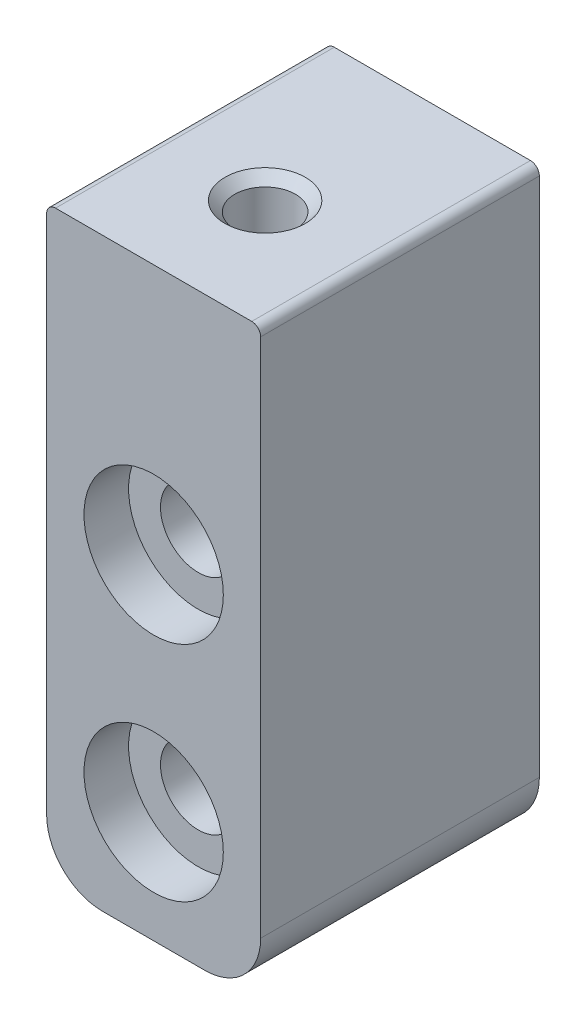
ISO-10303-21;
HEADER;
FILE_DESCRIPTION(('STEP AP214'),'2;1');
FILE_NAME('part.step','',(''),(''),'','','');
FILE_SCHEMA(('AUTOMOTIVE_DESIGN { 1 0 10303 214 1 1 1 1 }'));
ENDSEC;
DATA;
#1=APPLICATION_CONTEXT('core data for automotive mechanical design processes');
#2=APPLICATION_PROTOCOL_DEFINITION('international standard','automotive_design',2000,#1);
#3=PRODUCT_CONTEXT('',#1,'mechanical');
#4=PRODUCT('Part','Part','',(#3));
#5=PRODUCT_RELATED_PRODUCT_CATEGORY('part','',(#4));
#6=PRODUCT_DEFINITION_FORMATION('','',#4);
#7=PRODUCT_DEFINITION_CONTEXT('part definition',#1,'design');
#8=PRODUCT_DEFINITION('design','',#6,#7);
#9=PRODUCT_DEFINITION_SHAPE('','',#8);
#10=(LENGTH_UNIT() NAMED_UNIT(*) SI_UNIT(.MILLI.,.METRE.));
#11=(NAMED_UNIT(*) PLANE_ANGLE_UNIT() SI_UNIT($,.RADIAN.));
#12=(NAMED_UNIT(*) SI_UNIT($,.STERADIAN.) SOLID_ANGLE_UNIT());
#13=UNCERTAINTY_MEASURE_WITH_UNIT(LENGTH_MEASURE(1.E-05),#10,'distance_accuracy_value','');
#14=(GEOMETRIC_REPRESENTATION_CONTEXT(3) GLOBAL_UNCERTAINTY_ASSIGNED_CONTEXT((#13)) GLOBAL_UNIT_ASSIGNED_CONTEXT((#10,
#11,#12)) REPRESENTATION_CONTEXT('',''));
#15=CARTESIAN_POINT('',(0.,0.,0.));
#16=DIRECTION('',(0.,0.,1.));
#17=DIRECTION('',(1.,0.,0.));
#18=AXIS2_PLACEMENT_3D('',#15,#16,#17);
#19=CARTESIAN_POINT('',(6.096,0.,0.));
#20=DIRECTION('',(0.,0.,1.));
#21=DIRECTION('',(0.,-1.,0.));
#22=AXIS2_PLACEMENT_3D('',#19,#20,#21);
#23=PLANE('',#22);
#24=CARTESIAN_POINT('',(0.,-14.3002,0.));
#25=DIRECTION('',(0.,0.,1.));
#26=DIRECTION('',(1.,0.,0.));
#27=AXIS2_PLACEMENT_3D('',#24,#25,#26);
#28=CIRCLE('',#27,2.15265);
#29=CARTESIAN_POINT('',(2.15265,-14.3002,0.));
#30=VERTEX_POINT('',#29);
#31=EDGE_CURVE('E203',#30,#30,#28,.T.);
#32=ORIENTED_EDGE('',*,*,#31,.T.);
#33=EDGE_LOOP('',(#32));
#34=FACE_BOUND('',#33,.T.);
#35=CARTESIAN_POINT('',(0.,-27.0002,0.));
#36=DIRECTION('',(0.,0.,1.));
#37=DIRECTION('',(1.,0.,0.));
#38=AXIS2_PLACEMENT_3D('',#35,#36,#37);
#39=CIRCLE('',#38,2.15265);
#40=CARTESIAN_POINT('',(2.15265,-27.0002,0.));
#41=VERTEX_POINT('',#40);
#42=EDGE_CURVE('E179',#41,#41,#39,.T.);
#43=ORIENTED_EDGE('',*,*,#42,.T.);
#44=EDGE_LOOP('',(#43));
#45=FACE_BOUND('',#44,.T.);
#46=DIRECTION('',(0.,1.,0.));
#47=VECTOR('',#46,1.);
#48=CARTESIAN_POINT('',(-6.096,0.,0.));
#49=LINE('',#48,#47);
#50=CARTESIAN_POINT('',(-6.096,-30.1752,0.));
#51=VERTEX_POINT('',#50);
#52=CARTESIAN_POINT('',(-6.096,-0.508,0.));
#53=VERTEX_POINT('',#52);
#54=EDGE_CURVE('E162',#51,#53,#49,.T.);
#55=ORIENTED_EDGE('',*,*,#54,.T.);
#56=CARTESIAN_POINT('',(-5.588,-0.508,0.));
#57=DIRECTION('',(0.,0.,1.));
#58=DIRECTION('',(0.,-1.,0.));
#59=AXIS2_PLACEMENT_3D('',#56,#57,#58);
#60=CIRCLE('',#59,0.508);
#61=CARTESIAN_POINT('',(-5.588,0.,0.));
#62=VERTEX_POINT('',#61);
#63=EDGE_CURVE('E45',#53,#62,#60,.F.);
#64=ORIENTED_EDGE('',*,*,#63,.T.);
#65=DIRECTION('',(-1.,0.,0.));
#66=VECTOR('',#65,1.);
#67=CARTESIAN_POINT('',(6.096,0.,0.));
#68=LINE('',#67,#66);
#69=CARTESIAN_POINT('',(5.588,0.,0.));
#70=VERTEX_POINT('',#69);
#71=EDGE_CURVE('E129',#70,#62,#68,.T.);
#72=ORIENTED_EDGE('',*,*,#71,.F.);
#73=CARTESIAN_POINT('',(5.588,-0.508000000000002,0.));
#74=DIRECTION('',(0.,0.,1.));
#75=DIRECTION('',(0.,-1.,0.));
#76=AXIS2_PLACEMENT_3D('',#73,#74,#75);
#77=CIRCLE('',#76,0.508);
#78=CARTESIAN_POINT('',(6.096,-0.508000000000002,0.));
#79=VERTEX_POINT('',#78);
#80=EDGE_CURVE('E52',#70,#79,#77,.F.);
#81=ORIENTED_EDGE('',*,*,#80,.T.);
#82=DIRECTION('',(0.,1.,0.));
#83=VECTOR('',#82,1.);
#84=CARTESIAN_POINT('',(6.096,0.,0.));
#85=LINE('',#84,#83);
#86=CARTESIAN_POINT('',(6.096,-30.1752,0.));
#87=VERTEX_POINT('',#86);
#88=EDGE_CURVE('E107',#87,#79,#85,.T.);
#89=ORIENTED_EDGE('',*,*,#88,.F.);
#90=CARTESIAN_POINT('',(2.921,-30.1752,0.));
#91=DIRECTION('',(0.,0.,1.));
#92=DIRECTION('',(0.,-1.,0.));
#93=AXIS2_PLACEMENT_3D('',#90,#91,#92);
#94=CIRCLE('',#93,3.175);
#95=CARTESIAN_POINT('',(2.921,-33.3502,0.));
#96=VERTEX_POINT('',#95);
#97=EDGE_CURVE('E104',#87,#96,#94,.F.);
#98=ORIENTED_EDGE('',*,*,#97,.T.);
#99=DIRECTION('',(-1.,0.,0.));
#100=VECTOR('',#99,1.);
#101=CARTESIAN_POINT('',(6.096,-33.3502,0.));
#102=LINE('',#101,#100);
#103=CARTESIAN_POINT('',(-2.921,-33.3502,0.));
#104=VERTEX_POINT('',#103);
#105=EDGE_CURVE('E106',#96,#104,#102,.T.);
#106=ORIENTED_EDGE('',*,*,#105,.T.);
#107=CARTESIAN_POINT('',(-2.921,-30.1752,0.));
#108=DIRECTION('',(0.,0.,1.));
#109=DIRECTION('',(0.,-1.,0.));
#110=AXIS2_PLACEMENT_3D('',#107,#108,#109);
#111=CIRCLE('',#110,3.175);
#112=EDGE_CURVE('E112',#104,#51,#111,.F.);
#113=ORIENTED_EDGE('',*,*,#112,.T.);
#114=EDGE_LOOP('',(#55,#64,#72,#81,#89,#98,#106,#113));
#115=FACE_BOUND('',#114,.T.);
#116=ADVANCED_FACE('F37',(#34,#45,#115),#23,.F.);
#117=CARTESIAN_POINT('',(6.096,0.,0.));
#118=DIRECTION('',(0.,-1.,0.));
#119=DIRECTION('',(0.,0.,-1.));
#120=AXIS2_PLACEMENT_3D('',#117,#118,#119);
#121=PLANE('',#120);
#122=CARTESIAN_POINT('',(0.,0.,9.525));
#123=DIRECTION('',(0.,1.,0.));
#124=DIRECTION('',(0.,0.,1.));
#125=AXIS2_PLACEMENT_3D('',#122,#123,#124);
#126=CIRCLE('',#125,2.286);
#127=CARTESIAN_POINT('',(0.,0.,11.811));
#128=VERTEX_POINT('',#127);
#129=EDGE_CURVE('E219',#128,#128,#126,.T.);
#130=ORIENTED_EDGE('',*,*,#129,.F.);
#131=EDGE_LOOP('',(#130));
#132=FACE_BOUND('',#131,.T.);
#133=ORIENTED_EDGE('',*,*,#71,.T.);
#134=DIRECTION('',(0.,0.,1.));
#135=VECTOR('',#134,1.);
#136=CARTESIAN_POINT('',(-5.588,0.,15.875));
#137=LINE('',#136,#135);
#138=CARTESIAN_POINT('',(-5.588,0.,15.875));
#139=VERTEX_POINT('',#138);
#140=EDGE_CURVE('E153',#62,#139,#137,.T.);
#141=ORIENTED_EDGE('',*,*,#140,.T.);
#142=DIRECTION('',(-1.,0.,0.));
#143=VECTOR('',#142,1.);
#144=CARTESIAN_POINT('',(6.096,0.,15.875));
#145=LINE('',#144,#143);
#146=CARTESIAN_POINT('',(5.588,0.,15.875));
#147=VERTEX_POINT('',#146);
#148=EDGE_CURVE('E133',#147,#139,#145,.T.);
#149=ORIENTED_EDGE('',*,*,#148,.F.);
#150=DIRECTION('',(0.,0.,1.));
#151=VECTOR('',#150,1.);
#152=CARTESIAN_POINT('',(5.588,0.,0.));
#153=LINE('',#152,#151);
#154=EDGE_CURVE('E151',#147,#70,#153,.F.);
#155=ORIENTED_EDGE('',*,*,#154,.T.);
#156=EDGE_LOOP('',(#133,#141,#149,#155));
#157=FACE_BOUND('',#156,.T.);
#158=ADVANCED_FACE('F166',(#132,#157),#121,.F.);
#159=CARTESIAN_POINT('',(6.096,0.,15.875));
#160=DIRECTION('',(0.,0.,-1.));
#161=DIRECTION('',(0.,1.,0.));
#162=AXIS2_PLACEMENT_3D('',#159,#160,#161);
#163=PLANE('',#162);
#164=CARTESIAN_POINT('',(0.,-14.3002,15.875));
#165=DIRECTION('',(0.,0.,1.));
#166=DIRECTION('',(1.,0.,0.));
#167=AXIS2_PLACEMENT_3D('',#164,#165,#166);
#168=CIRCLE('',#167,3.96875);
#169=CARTESIAN_POINT('',(3.96875,-14.3002,15.875));
#170=VERTEX_POINT('',#169);
#171=EDGE_CURVE('E212',#170,#170,#168,.T.);
#172=ORIENTED_EDGE('',*,*,#171,.F.);
#173=EDGE_LOOP('',(#172));
#174=FACE_BOUND('',#173,.T.);
#175=CARTESIAN_POINT('',(0.,-27.0002,15.875));
#176=DIRECTION('',(0.,0.,1.));
#177=DIRECTION('',(1.,0.,0.));
#178=AXIS2_PLACEMENT_3D('',#175,#176,#177);
#179=CIRCLE('',#178,3.96875);
#180=CARTESIAN_POINT('',(3.96875,-27.0002,15.875));
#181=VERTEX_POINT('',#180);
#182=EDGE_CURVE('E199',#181,#181,#179,.T.);
#183=ORIENTED_EDGE('',*,*,#182,.F.);
#184=EDGE_LOOP('',(#183));
#185=FACE_BOUND('',#184,.T.);
#186=ORIENTED_EDGE('',*,*,#148,.T.);
#187=CARTESIAN_POINT('',(-5.588,-0.508000000000002,15.875));
#188=DIRECTION('',(0.,0.,-1.));
#189=DIRECTION('',(0.,1.,0.));
#190=AXIS2_PLACEMENT_3D('',#187,#188,#189);
#191=CIRCLE('',#190,0.508);
#192=CARTESIAN_POINT('',(-6.096,-0.508000000000002,15.875));
#193=VERTEX_POINT('',#192);
#194=EDGE_CURVE('E158',#139,#193,#191,.F.);
#195=ORIENTED_EDGE('',*,*,#194,.T.);
#196=DIRECTION('',(0.,-1.,0.));
#197=VECTOR('',#196,1.);
#198=CARTESIAN_POINT('',(-6.096,0.,15.875));
#199=LINE('',#198,#197);
#200=CARTESIAN_POINT('',(-6.096,-30.1752,15.875));
#201=VERTEX_POINT('',#200);
#202=EDGE_CURVE('E173',#193,#201,#199,.T.);
#203=ORIENTED_EDGE('',*,*,#202,.T.);
#204=CARTESIAN_POINT('',(-2.921,-30.1752,15.875));
#205=DIRECTION('',(0.,0.,-1.));
#206=DIRECTION('',(0.,1.,0.));
#207=AXIS2_PLACEMENT_3D('',#204,#205,#206);
#208=CIRCLE('',#207,3.175);
#209=CARTESIAN_POINT('',(-2.921,-33.3502,15.875));
#210=VERTEX_POINT('',#209);
#211=EDGE_CURVE('E147',#201,#210,#208,.F.);
#212=ORIENTED_EDGE('',*,*,#211,.T.);
#213=DIRECTION('',(-1.,0.,0.));
#214=VECTOR('',#213,1.);
#215=CARTESIAN_POINT('',(6.096,-33.3502,15.875));
#216=LINE('',#215,#214);
#217=CARTESIAN_POINT('',(2.921,-33.3502,15.875));
#218=VERTEX_POINT('',#217);
#219=EDGE_CURVE('E122',#218,#210,#216,.T.);
#220=ORIENTED_EDGE('',*,*,#219,.F.);
#221=CARTESIAN_POINT('',(2.921,-30.1752,15.875));
#222=DIRECTION('',(0.,0.,-1.));
#223=DIRECTION('',(0.,1.,0.));
#224=AXIS2_PLACEMENT_3D('',#221,#222,#223);
#225=CIRCLE('',#224,3.175);
#226=CARTESIAN_POINT('',(6.096,-30.1752,15.875));
#227=VERTEX_POINT('',#226);
#228=EDGE_CURVE('E128',#218,#227,#225,.F.);
#229=ORIENTED_EDGE('',*,*,#228,.T.);
#230=DIRECTION('',(0.,-1.,0.));
#231=VECTOR('',#230,1.);
#232=CARTESIAN_POINT('',(6.096,0.,15.875));
#233=LINE('',#232,#231);
#234=CARTESIAN_POINT('',(6.096,-0.508000000000003,15.875));
#235=VERTEX_POINT('',#234);
#236=EDGE_CURVE('E123',#235,#227,#233,.T.);
#237=ORIENTED_EDGE('',*,*,#236,.F.);
#238=CARTESIAN_POINT('',(5.588,-0.508000000000003,15.875));
#239=DIRECTION('',(0.,0.,-1.));
#240=DIRECTION('',(0.,1.,0.));
#241=AXIS2_PLACEMENT_3D('',#238,#239,#240);
#242=CIRCLE('',#241,0.508);
#243=EDGE_CURVE('E156',#235,#147,#242,.F.);
#244=ORIENTED_EDGE('',*,*,#243,.T.);
#245=EDGE_LOOP('',(#186,#195,#203,#212,#220,#229,#237,#244));
#246=FACE_BOUND('',#245,.T.);
#247=ADVANCED_FACE('F172',(#174,#185,#246),#163,.F.);
#248=CARTESIAN_POINT('',(6.096,-33.3502,0.));
#249=DIRECTION('',(0.,1.,0.));
#250=DIRECTION('',(0.,0.,1.));
#251=AXIS2_PLACEMENT_3D('',#248,#249,#250);
#252=PLANE('',#251);
#253=ORIENTED_EDGE('',*,*,#219,.T.);
#254=DIRECTION('',(0.,0.,-1.));
#255=VECTOR('',#254,1.);
#256=CARTESIAN_POINT('',(-2.921,-33.3502,0.));
#257=LINE('',#256,#255);
#258=EDGE_CURVE('E113',#210,#104,#257,.T.);
#259=ORIENTED_EDGE('',*,*,#258,.T.);
#260=ORIENTED_EDGE('',*,*,#105,.F.);
#261=DIRECTION('',(0.,0.,-1.));
#262=VECTOR('',#261,1.);
#263=CARTESIAN_POINT('',(2.921,-33.3502,0.));
#264=LINE('',#263,#262);
#265=EDGE_CURVE('E119',#96,#218,#264,.F.);
#266=ORIENTED_EDGE('',*,*,#265,.T.);
#267=EDGE_LOOP('',(#253,#259,#260,#266));
#268=FACE_BOUND('',#267,.T.);
#269=ADVANCED_FACE('F118',(#268),#252,.F.);
#270=CARTESIAN_POINT('',(6.096,-33.3502,0.));
#271=DIRECTION('',(-1.,0.,0.));
#272=DIRECTION('',(0.,0.,1.));
#273=AXIS2_PLACEMENT_3D('',#270,#271,#272);
#274=PLANE('',#273);
#275=ORIENTED_EDGE('',*,*,#88,.T.);
#276=DIRECTION('',(0.,0.,1.));
#277=VECTOR('',#276,1.);
#278=CARTESIAN_POINT('',(6.096,-0.508000000000002,0.));
#279=LINE('',#278,#277);
#280=EDGE_CURVE('E12',#79,#235,#279,.T.);
#281=ORIENTED_EDGE('',*,*,#280,.T.);
#282=ORIENTED_EDGE('',*,*,#236,.T.);
#283=DIRECTION('',(0.,0.,-1.));
#284=VECTOR('',#283,1.);
#285=CARTESIAN_POINT('',(6.096,-30.1752,0.));
#286=LINE('',#285,#284);
#287=EDGE_CURVE('E149',#227,#87,#286,.T.);
#288=ORIENTED_EDGE('',*,*,#287,.T.);
#289=EDGE_LOOP('',(#275,#281,#282,#288));
#290=FACE_BOUND('',#289,.T.);
#291=ADVANCED_FACE('F252',(#290),#274,.F.);
#292=CARTESIAN_POINT('',(-6.096,-33.3502,0.));
#293=DIRECTION('',(-1.,0.,0.));
#294=DIRECTION('',(0.,0.,1.));
#295=AXIS2_PLACEMENT_3D('',#292,#293,#294);
#296=PLANE('',#295);
#297=ORIENTED_EDGE('',*,*,#202,.F.);
#298=DIRECTION('',(0.,0.,1.));
#299=VECTOR('',#298,1.);
#300=CARTESIAN_POINT('',(-6.096,-0.508,0.));
#301=LINE('',#300,#299);
#302=EDGE_CURVE('E60',#193,#53,#301,.F.);
#303=ORIENTED_EDGE('',*,*,#302,.T.);
#304=ORIENTED_EDGE('',*,*,#54,.F.);
#305=DIRECTION('',(0.,0.,-1.));
#306=VECTOR('',#305,1.);
#307=CARTESIAN_POINT('',(-6.096,-30.1752,15.875));
#308=LINE('',#307,#306);
#309=EDGE_CURVE('E143',#51,#201,#308,.F.);
#310=ORIENTED_EDGE('',*,*,#309,.T.);
#311=EDGE_LOOP('',(#297,#303,#304,#310));
#312=FACE_BOUND('',#311,.T.);
#313=ADVANCED_FACE('F174',(#312),#296,.T.);
#314=CARTESIAN_POINT('',(0.,-27.0002,15.875));
#315=DIRECTION('',(0.,0.,1.));
#316=DIRECTION('',(1.,0.,0.));
#317=AXIS2_PLACEMENT_3D('',#314,#315,#316);
#318=CYLINDRICAL_SURFACE('',#317,2.15265);
#319=ORIENTED_EDGE('',*,*,#42,.F.);
#320=EDGE_LOOP('',(#319));
#321=FACE_BOUND('',#320,.T.);
#322=CARTESIAN_POINT('',(0.,-27.0002,13.335));
#323=DIRECTION('',(0.,0.,1.));
#324=DIRECTION('',(1.,0.,0.));
#325=AXIS2_PLACEMENT_3D('',#322,#323,#324);
#326=CIRCLE('',#325,2.15265);
#327=CARTESIAN_POINT('',(2.15265,-27.0002,13.335));
#328=VERTEX_POINT('',#327);
#329=EDGE_CURVE('E193',#328,#328,#326,.T.);
#330=ORIENTED_EDGE('',*,*,#329,.T.);
#331=EDGE_LOOP('',(#330));
#332=FACE_BOUND('',#331,.T.);
#333=ADVANCED_FACE('F260',(#321,#332),#318,.F.);
#334=CARTESIAN_POINT('',(2.15265,-27.0002,13.335));
#335=DIRECTION('',(0.,0.,-1.));
#336=DIRECTION('',(-1.,0.,0.));
#337=AXIS2_PLACEMENT_3D('',#334,#335,#336);
#338=PLANE('',#337);
#339=ORIENTED_EDGE('',*,*,#329,.F.);
#340=EDGE_LOOP('',(#339));
#341=FACE_BOUND('',#340,.T.);
#342=CARTESIAN_POINT('',(0.,-27.0002,13.335));
#343=DIRECTION('',(0.,0.,1.));
#344=DIRECTION('',(1.,0.,0.));
#345=AXIS2_PLACEMENT_3D('',#342,#343,#344);
#346=CIRCLE('',#345,3.96875);
#347=CARTESIAN_POINT('',(3.96875,-27.0002,13.335));
#348=VERTEX_POINT('',#347);
#349=EDGE_CURVE('E196',#348,#348,#346,.T.);
#350=ORIENTED_EDGE('',*,*,#349,.T.);
#351=EDGE_LOOP('',(#350));
#352=FACE_BOUND('',#351,.T.);
#353=ADVANCED_FACE('F265',(#341,#352),#338,.F.);
#354=CARTESIAN_POINT('',(0.,-27.0002,15.875));
#355=DIRECTION('',(0.,0.,1.));
#356=DIRECTION('',(1.,0.,0.));
#357=AXIS2_PLACEMENT_3D('',#354,#355,#356);
#358=CYLINDRICAL_SURFACE('',#357,3.96875);
#359=ORIENTED_EDGE('',*,*,#349,.F.);
#360=EDGE_LOOP('',(#359));
#361=FACE_BOUND('',#360,.T.);
#362=ORIENTED_EDGE('',*,*,#182,.T.);
#363=EDGE_LOOP('',(#362));
#364=FACE_BOUND('',#363,.T.);
#365=ADVANCED_FACE('F269',(#361,#364),#358,.F.);
#366=CARTESIAN_POINT('',(0.,-14.3002,15.875));
#367=DIRECTION('',(0.,0.,1.));
#368=DIRECTION('',(1.,0.,0.));
#369=AXIS2_PLACEMENT_3D('',#366,#367,#368);
#370=CYLINDRICAL_SURFACE('',#369,2.15265);
#371=CARTESIAN_POINT('',(0.,-12.14755,11.2522));
#372=CARTESIAN_POINT('',(0.0828486453500373,-12.1475566224178,11.2521931822336));
#373=CARTESIAN_POINT('',(0.165806587410505,-12.1523815529834,11.2461898141937));
#374=CARTESIAN_POINT('',(0.329047512493893,-12.1712524214495,11.222581733653));
#375=CARTESIAN_POINT('',(0.409324723077608,-12.1853170593674,11.2049534935827));
#376=CARTESIAN_POINT('',(0.564399475847473,-12.221341233981,11.1593700840898));
#377=CARTESIAN_POINT('',(0.639228145264779,-12.2432508508739,11.1314801822372));
#378=CARTESIAN_POINT('',(0.782547643910851,-12.2933871362543,11.0667626556805));
#379=CARTESIAN_POINT('',(0.851038148592336,-12.3216141279717,11.029934573644));
#380=CARTESIAN_POINT('',(1.0037492563681,-12.3934291287842,10.9344030274948));
#381=CARTESIAN_POINT('',(1.08509839486217,-12.4389374711482,10.8725530381713));
#382=CARTESIAN_POINT('',(1.23455416609968,-12.5345050970952,10.7371523278942));
#383=CARTESIAN_POINT('',(1.30262152825393,-12.5845772529293,10.6635680435101));
#384=CARTESIAN_POINT('',(1.42608717407828,-12.6856939194386,10.5046933655226));
#385=CARTESIAN_POINT('',(1.4812665468842,-12.7367412207488,10.4192352807132));
#386=CARTESIAN_POINT('',(1.57672169999146,-12.833095089715,10.2374966429837));
#387=CARTESIAN_POINT('',(1.61704700555517,-12.8784203967274,10.1412534749238));
#388=CARTESIAN_POINT('',(1.66698557635806,-12.9378913450551,9.98117505530567));
#389=CARTESIAN_POINT('',(1.68236083633576,-12.9570874472733,9.92104384386153));
#390=CARTESIAN_POINT('',(1.70668652795431,-12.9881353379129,9.79771425106427));
#391=CARTESIAN_POINT('',(1.71565281831129,-13.0000052446699,9.73452385657039));
#392=CARTESIAN_POINT('',(1.72652179631027,-13.0144631562615,9.60584381213406));
#393=CARTESIAN_POINT('',(1.72836064653766,-13.0169672687594,9.54033866175485));
#394=CARTESIAN_POINT('',(1.72459894303726,-13.0119199167789,9.40991442620071));
#395=CARTESIAN_POINT('',(1.7189923792542,-13.004360328711,9.34499585712941));
#396=CARTESIAN_POINT('',(1.69949954324349,-12.9788803622684,9.20812285337038));
#397=CARTESIAN_POINT('',(1.68448156656511,-12.9595564618783,9.13660411750049));
#398=CARTESIAN_POINT('',(1.64650496122898,-12.9131821193538,8.99829574337548));
#399=CARTESIAN_POINT('',(1.62352263221427,-12.886108658361,8.93152094499352));
#400=CARTESIAN_POINT('',(1.55736543637995,-12.8129248101059,8.77087225478823));
#401=CARTESIAN_POINT('',(1.50983481860842,-12.7640496032915,8.68006960894411));
#402=CARTESIAN_POINT('',(1.40051168527332,-12.6637345290673,8.50908042669843));
#403=CARTESIAN_POINT('',(1.33869802443952,-12.6122909487241,8.42890991032669));
#404=CARTESIAN_POINT('',(1.19920411098472,-12.5103702643382,8.27760129609948));
#405=CARTESIAN_POINT('',(1.12112790592116,-12.459960599863,8.20677912293775));
#406=CARTESIAN_POINT('',(0.950658432843426,-12.366408441162,8.07906078256295));
#407=CARTESIAN_POINT('',(0.858304291215654,-12.3232467399853,8.02212762227684));
#408=CARTESIAN_POINT('',(0.68900156757178,-12.2593982786616,7.93923012414489));
#409=CARTESIAN_POINT('',(0.615199628423848,-12.2358140472959,7.90906554110431));
#410=CARTESIAN_POINT('',(0.462266519693319,-12.196291959123,7.85887015678328));
#411=CARTESIAN_POINT('',(0.383139400285601,-12.1803483643785,7.8388317503655));
#412=CARTESIAN_POINT('',(0.22111707687046,-12.1573667620696,7.81002820438601));
#413=CARTESIAN_POINT('',(0.138204059930139,-12.1503766027325,7.80132363011817));
#414=CARTESIAN_POINT('',(-0.0282567621822698,-12.146127524386,7.7960265245845));
#415=CARTESIAN_POINT('',(-0.111804429753873,-12.1488665528492,7.79943143862921));
#416=CARTESIAN_POINT('',(-0.269764084253015,-12.1631702638143,7.81730034447163));
#417=CARTESIAN_POINT('',(-0.34435676166594,-12.1739796333488,7.83081807315197));
#418=CARTESIAN_POINT('',(-0.489837476964898,-12.2027101416528,7.86701854560647));
#419=CARTESIAN_POINT('',(-0.560724437967631,-12.2206333348444,7.88970393697133));
#420=CARTESIAN_POINT('',(-0.701508113820445,-12.2636525546039,7.94476069847374));
#421=CARTESIAN_POINT('',(-0.77109896052386,-12.2891097583622,7.97762508716945));
#422=CARTESIAN_POINT('',(-0.903735561787044,-12.3451160883866,8.05114855838283));
#423=CARTESIAN_POINT('',(-0.966780897432259,-12.3756655402325,8.09180813932154));
#424=CARTESIAN_POINT('',(-1.09716919438881,-12.4463908368645,8.18814034410565));
#425=CARTESIAN_POINT('',(-1.16308759689513,-12.4872962963098,8.24519828585097));
#426=CARTESIAN_POINT('',(-1.28509276444527,-12.5716321147039,8.36773536379708));
#427=CARTESIAN_POINT('',(-1.34115160457031,-12.6150691955521,8.43323753631595));
#428=CARTESIAN_POINT('',(-1.42307820149389,-12.6845249446912,8.544793659333));
#429=CARTESIAN_POINT('',(-1.45217211954832,-12.7107035475972,8.58841870982389));
#430=CARTESIAN_POINT('',(-1.50651370192734,-12.7621117132247,8.67859010336987));
#431=CARTESIAN_POINT('',(-1.53175936071258,-12.7873407759658,8.72513795193549));
#432=CARTESIAN_POINT('',(-1.57812092578641,-12.8357697338658,8.82102562062576));
#433=CARTESIAN_POINT('',(-1.59925099344121,-12.8589764297838,8.87035508563038));
#434=CARTESIAN_POINT('',(-1.63717047660621,-12.9022011129867,8.9719796333207));
#435=CARTESIAN_POINT('',(-1.65396287975668,-12.9222212913723,9.02427264437957));
#436=CARTESIAN_POINT('',(-1.6838879866085,-12.958920853926,9.13598066650064));
#437=CARTESIAN_POINT('',(-1.69663113748464,-12.9752158650495,9.19563271966042));
#438=CARTESIAN_POINT('',(-1.71578374416374,-13.0001064751687,9.31742769927743));
#439=CARTESIAN_POINT('',(-1.72220960448203,-13.0087220104887,9.37956373591291));
#440=CARTESIAN_POINT('',(-1.72823535208509,-13.0167920182979,9.50518187401097));
#441=CARTESIAN_POINT('',(-1.72779334126101,-13.0161902601172,9.5686698761381));
#442=CARTESIAN_POINT('',(-1.72002333174313,-13.0058055320027,9.69449575968973));
#443=CARTESIAN_POINT('',(-1.71268513165036,-12.996008960387,9.75683179771303));
#444=CARTESIAN_POINT('',(-1.68909245572359,-12.9655407226171,9.89402898548541));
#445=CARTESIAN_POINT('',(-1.67105933521942,-12.9427532167803,9.96809601206792));
#446=CARTESIAN_POINT('',(-1.62653876958782,-12.8897134716748,10.1108482369334));
#447=CARTESIAN_POINT('',(-1.60002624468727,-12.8594391494489,10.1795167075093));
#448=CARTESIAN_POINT('',(-1.52523337744794,-12.7797486234503,10.3424918934215));
#449=CARTESIAN_POINT('',(-1.47258053483596,-12.7280285085964,10.4336581200117));
#450=CARTESIAN_POINT('',(-1.35221034906983,-12.6233463054487,10.6046667542878));
#451=CARTESIAN_POINT('',(-1.28447451789063,-12.5703827649131,10.6844950660988));
#452=CARTESIAN_POINT('',(-1.132960083917,-12.4674871553343,10.8330729717498));
#453=CARTESIAN_POINT('',(-1.04894006467103,-12.4176178561466,10.9016228304521));
#454=CARTESIAN_POINT('',(-0.866199096451856,-12.3268969692282,11.0232896581117));
#455=CARTESIAN_POINT('',(-0.767522045290688,-12.2860193287015,11.0764513586232));
#456=CARTESIAN_POINT('',(-0.591680171934353,-12.2291117120432,11.149517786341));
#457=CARTESIAN_POINT('',(-0.517868983385237,-12.2093209307892,11.1746180222016));
#458=CARTESIAN_POINT('',(-0.366042910464745,-12.1774929419907,11.2147800223729));
#459=CARTESIAN_POINT('',(-0.288039010161874,-12.1654364515919,11.2298667552697));
#460=CARTESIAN_POINT('',(-0.174465202932963,-12.1543482616844,11.2437210721158));
#461=CARTESIAN_POINT('',(-0.139706932107876,-12.1518048642634,11.2468946431347));
#462=CARTESIAN_POINT('',(-0.0699723090375966,-12.148404127623,11.251135805717));
#463=CARTESIAN_POINT('',(-0.0349959053297823,-12.1475472026398,11.252202879877));
#464=CARTESIAN_POINT('',(0.,-12.14755,11.2522));
#465=B_SPLINE_CURVE_WITH_KNOTS('',3,(#371,#372,#373,#374,#375,#376,#377,#378,#379,#380,#381,
#382,#383,#384,#385,#386,#387,#388,#389,#390,#391,#392,#393,#394,#395,#396,#397,#398,#399,#400,
#401,#402,#403,#404,#405,#406,#407,#408,#409,#410,#411,#412,#413,#414,#415,#416,#417,#418,#419,
#420,#421,#422,#423,#424,#425,#426,#427,#428,#429,#430,#431,#432,#433,#434,#435,#436,#437,#438,
#439,#440,#441,#442,#443,#444,#445,#446,#447,#448,#449,#450,#451,#452,#453,#454,#455,#456,#457,
#458,#459,#460,#461,#462,#463,#464),.UNSPECIFIED.,.T.,.F.,(4,2,2,2,2,2,2,2,2,2,2,2,2,2,2,2,2,2,
2,2,2,2,2,2,2,2,2,2,2,2,2,2,2,2,2,2,2,2,2,2,2,2,2,2,2,2,4),(0.,0.248393617025248,
0.497291506987842,0.744632943665383,0.99198703852202,1.32581448323113,1.66061448596262,
2.00074377599614,2.33972854309195,2.5340056362374,2.72780031915442,2.92332678042962,
3.11901116971711,3.34452064710877,3.57070704253007,3.90956970884322,4.24893729409409,
4.59781126962069,4.94574562555535,5.19418532180443,5.44243815220581,5.69201221456174,
5.94153362841738,6.17023952798782,6.39901152432122,6.64129783783645,6.88359964819766,
7.171507073979,7.46021724024278,7.63586824333076,7.81161047711742,7.98673687988162,
8.16174233777544,8.35045200246358,8.5386703279371,8.72803734586881,8.91768493243927,
9.15504191778598,9.39310753582352,9.74319601307862,10.093715998075,10.4498966966194,
10.8050313762007,11.0453969877535,11.2851609752128,11.3900585884442,11.4949819637053),.UNSPECIFIED.);
#466=CARTESIAN_POINT('',(0.,-12.14755,11.2522));
#467=VERTEX_POINT('',#466);
#468=EDGE_CURVE('E136',#467,#467,#465,.T.);
#469=ORIENTED_EDGE('',*,*,#468,.T.);
#470=EDGE_LOOP('',(#469));
#471=FACE_BOUND('',#470,.T.);
#472=ORIENTED_EDGE('',*,*,#31,.F.);
#473=EDGE_LOOP('',(#472));
#474=FACE_BOUND('',#473,.T.);
#475=CARTESIAN_POINT('',(0.,-14.3002,13.335));
#476=DIRECTION('',(0.,0.,1.));
#477=DIRECTION('',(1.,0.,0.));
#478=AXIS2_PLACEMENT_3D('',#475,#476,#477);
#479=CIRCLE('',#478,2.15265);
#480=CARTESIAN_POINT('',(2.15265,-14.3002,13.335));
#481=VERTEX_POINT('',#480);
#482=EDGE_CURVE('E207',#481,#481,#479,.T.);
#483=ORIENTED_EDGE('',*,*,#482,.T.);
#484=EDGE_LOOP('',(#483));
#485=FACE_BOUND('',#484,.T.);
#486=ADVANCED_FACE('F272',(#471,#474,#485),#370,.F.);
#487=CARTESIAN_POINT('',(2.15265,-14.3002,13.335));
#488=DIRECTION('',(0.,0.,-1.));
#489=DIRECTION('',(-1.,0.,0.));
#490=AXIS2_PLACEMENT_3D('',#487,#488,#489);
#491=PLANE('',#490);
#492=ORIENTED_EDGE('',*,*,#482,.F.);
#493=EDGE_LOOP('',(#492));
#494=FACE_BOUND('',#493,.T.);
#495=CARTESIAN_POINT('',(0.,-14.3002,13.335));
#496=DIRECTION('',(0.,0.,1.));
#497=DIRECTION('',(1.,0.,0.));
#498=AXIS2_PLACEMENT_3D('',#495,#496,#497);
#499=CIRCLE('',#498,3.96875);
#500=CARTESIAN_POINT('',(3.96875,-14.3002,13.335));
#501=VERTEX_POINT('',#500);
#502=EDGE_CURVE('E210',#501,#501,#499,.T.);
#503=ORIENTED_EDGE('',*,*,#502,.T.);
#504=EDGE_LOOP('',(#503));
#505=FACE_BOUND('',#504,.T.);
#506=ADVANCED_FACE('F277',(#494,#505),#491,.F.);
#507=CARTESIAN_POINT('',(0.,-14.3002,15.875));
#508=DIRECTION('',(0.,0.,1.));
#509=DIRECTION('',(1.,0.,0.));
#510=AXIS2_PLACEMENT_3D('',#507,#508,#509);
#511=CYLINDRICAL_SURFACE('',#510,3.96875);
#512=ORIENTED_EDGE('',*,*,#502,.F.);
#513=EDGE_LOOP('',(#512));
#514=FACE_BOUND('',#513,.T.);
#515=ORIENTED_EDGE('',*,*,#171,.T.);
#516=EDGE_LOOP('',(#515));
#517=FACE_BOUND('',#516,.T.);
#518=ADVANCED_FACE('F281',(#514,#517),#511,.F.);
#519=CARTESIAN_POINT('',(0.,0.,9.525));
#520=DIRECTION('',(0.,1.,0.));
#521=DIRECTION('',(0.,0.,1.));
#522=AXIS2_PLACEMENT_3D('',#519,#520,#521);
#523=CYLINDRICAL_SURFACE('',#522,1.7272);
#524=CARTESIAN_POINT('',(0.,-0.558800000000001,9.525));
#525=DIRECTION('',(0.,1.,0.));
#526=DIRECTION('',(0.,0.,1.));
#527=AXIS2_PLACEMENT_3D('',#524,#525,#526);
#528=CIRCLE('',#527,1.7272);
#529=CARTESIAN_POINT('',(0.,-0.558800000000001,11.2522));
#530=VERTEX_POINT('',#529);
#531=EDGE_CURVE('E216',#530,#530,#528,.T.);
#532=ORIENTED_EDGE('',*,*,#531,.T.);
#533=EDGE_LOOP('',(#532));
#534=FACE_BOUND('',#533,.T.);
#535=ORIENTED_EDGE('',*,*,#468,.F.);
#536=EDGE_LOOP('',(#535));
#537=FACE_BOUND('',#536,.T.);
#538=ADVANCED_FACE('F284',(#534,#537),#523,.F.);
#539=CARTESIAN_POINT('',(0.,0.,9.525));
#540=DIRECTION('',(0.,1.,0.));
#541=DIRECTION('',(0.,0.,1.));
#542=AXIS2_PLACEMENT_3D('',#539,#540,#541);
#543=CONICAL_SURFACE('',#542,2.286,0.785398163397449);
#544=ORIENTED_EDGE('',*,*,#531,.F.);
#545=EDGE_LOOP('',(#544));
#546=FACE_BOUND('',#545,.T.);
#547=ORIENTED_EDGE('',*,*,#129,.T.);
#548=EDGE_LOOP('',(#547));
#549=FACE_BOUND('',#548,.T.);
#550=ADVANCED_FACE('F223',(#546,#549),#543,.F.);
#551=CARTESIAN_POINT('',(-2.921,-30.1752,0.));
#552=DIRECTION('',(0.,0.,1.));
#553=DIRECTION('',(1.,0.,0.));
#554=AXIS2_PLACEMENT_3D('',#551,#552,#553);
#555=CYLINDRICAL_SURFACE('',#554,3.175);
#556=ORIENTED_EDGE('',*,*,#211,.F.);
#557=ORIENTED_EDGE('',*,*,#309,.F.);
#558=ORIENTED_EDGE('',*,*,#112,.F.);
#559=ORIENTED_EDGE('',*,*,#258,.F.);
#560=EDGE_LOOP('',(#556,#557,#558,#559));
#561=FACE_BOUND('',#560,.T.);
#562=ADVANCED_FACE('F237',(#561),#555,.T.);
#563=CARTESIAN_POINT('',(2.921,-30.1752,0.));
#564=DIRECTION('',(0.,0.,-1.));
#565=DIRECTION('',(-1.,0.,0.));
#566=AXIS2_PLACEMENT_3D('',#563,#564,#565);
#567=CYLINDRICAL_SURFACE('',#566,3.175);
#568=ORIENTED_EDGE('',*,*,#228,.F.);
#569=ORIENTED_EDGE('',*,*,#265,.F.);
#570=ORIENTED_EDGE('',*,*,#97,.F.);
#571=ORIENTED_EDGE('',*,*,#287,.F.);
#572=EDGE_LOOP('',(#568,#569,#570,#571));
#573=FACE_BOUND('',#572,.T.);
#574=ADVANCED_FACE('F126',(#573),#567,.T.);
#575=CARTESIAN_POINT('',(-5.588,-0.508,0.));
#576=DIRECTION('',(0.,0.,-1.));
#577=DIRECTION('',(0.,1.,0.));
#578=AXIS2_PLACEMENT_3D('',#575,#576,#577);
#579=CYLINDRICAL_SURFACE('',#578,0.508);
#580=ORIENTED_EDGE('',*,*,#63,.F.);
#581=ORIENTED_EDGE('',*,*,#302,.F.);
#582=ORIENTED_EDGE('',*,*,#194,.F.);
#583=ORIENTED_EDGE('',*,*,#140,.F.);
#584=EDGE_LOOP('',(#580,#581,#582,#583));
#585=FACE_BOUND('',#584,.T.);
#586=ADVANCED_FACE('F170',(#585),#579,.T.);
#587=CARTESIAN_POINT('',(5.588,-0.508000000000002,0.));
#588=DIRECTION('',(0.,0.,1.));
#589=DIRECTION('',(0.,-1.,0.));
#590=AXIS2_PLACEMENT_3D('',#587,#588,#589);
#591=CYLINDRICAL_SURFACE('',#590,0.508);
#592=ORIENTED_EDGE('',*,*,#80,.F.);
#593=ORIENTED_EDGE('',*,*,#154,.F.);
#594=ORIENTED_EDGE('',*,*,#243,.F.);
#595=ORIENTED_EDGE('',*,*,#280,.F.);
#596=EDGE_LOOP('',(#592,#593,#594,#595));
#597=FACE_BOUND('',#596,.T.);
#598=ADVANCED_FACE('F39',(#597),#591,.T.);
#599=CLOSED_SHELL('',(#116,#158,#247,#269,#291,#313,#333,#353,#365,#486,#506,#518,#538,#550,
#562,#574,#586,#598));
#600=MANIFOLD_SOLID_BREP('B2',#599);
#601=ADVANCED_BREP_SHAPE_REPRESENTATION('',(#18,#600),#14);
#602=SHAPE_DEFINITION_REPRESENTATION(#9,#601);
ENDSEC;
END-ISO-10303-21;
